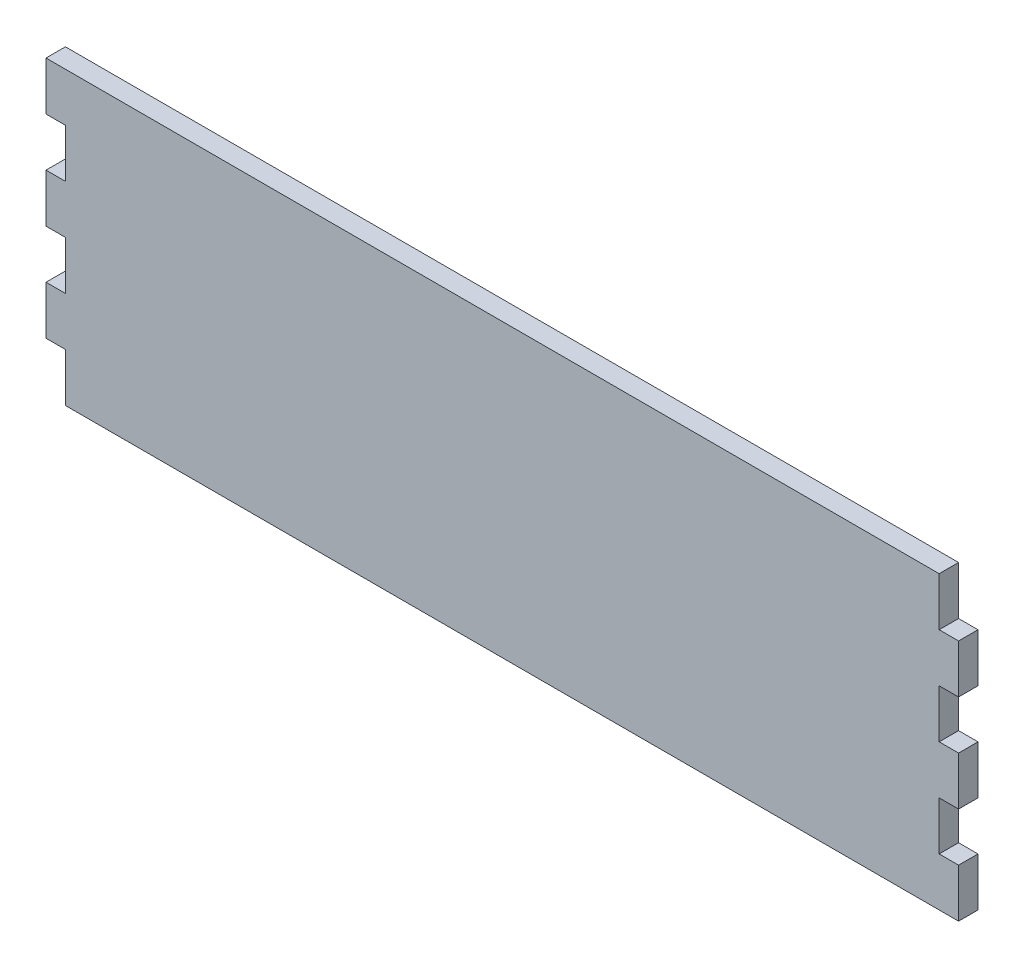
ISO-10303-21;
HEADER;
FILE_DESCRIPTION(('STEP AP214'),'2;1');
FILE_NAME('part.step','',(''),(''),'','','');
FILE_SCHEMA(('AUTOMOTIVE_DESIGN { 1 0 10303 214 1 1 1 1 }'));
ENDSEC;
DATA;
#1=APPLICATION_CONTEXT('core data for automotive mechanical design processes');
#2=APPLICATION_PROTOCOL_DEFINITION('international standard','automotive_design',2000,#1);
#3=PRODUCT_CONTEXT('',#1,'mechanical');
#4=PRODUCT('Part','Part','',(#3));
#5=PRODUCT_RELATED_PRODUCT_CATEGORY('part','',(#4));
#6=PRODUCT_DEFINITION_FORMATION('','',#4);
#7=PRODUCT_DEFINITION_CONTEXT('part definition',#1,'design');
#8=PRODUCT_DEFINITION('design','',#6,#7);
#9=PRODUCT_DEFINITION_SHAPE('','',#8);
#10=(LENGTH_UNIT() NAMED_UNIT(*) SI_UNIT(.MILLI.,.METRE.));
#11=(NAMED_UNIT(*) PLANE_ANGLE_UNIT() SI_UNIT($,.RADIAN.));
#12=(NAMED_UNIT(*) SI_UNIT($,.STERADIAN.) SOLID_ANGLE_UNIT());
#13=UNCERTAINTY_MEASURE_WITH_UNIT(LENGTH_MEASURE(1.E-05),#10,'distance_accuracy_value','');
#14=(GEOMETRIC_REPRESENTATION_CONTEXT(3) GLOBAL_UNCERTAINTY_ASSIGNED_CONTEXT((#13)) GLOBAL_UNIT_ASSIGNED_CONTEXT((#10,
#11,#12)) REPRESENTATION_CONTEXT('',''));
#15=CARTESIAN_POINT('',(0.,0.,0.));
#16=DIRECTION('',(0.,0.,1.));
#17=DIRECTION('',(1.,0.,0.));
#18=AXIS2_PLACEMENT_3D('',#15,#16,#17);
#19=CARTESIAN_POINT('',(230.,0.,5.));
#20=DIRECTION('',(0.,1.,0.));
#21=DIRECTION('',(-1.,0.,0.));
#22=AXIS2_PLACEMENT_3D('',#19,#20,#21);
#23=PLANE('',#22);
#24=DIRECTION('',(1.,0.,0.));
#25=VECTOR('',#24,1.);
#26=CARTESIAN_POINT('',(230.,0.,0.));
#27=LINE('',#26,#25);
#28=CARTESIAN_POINT('',(0.,0.,0.));
#29=VERTEX_POINT('',#28);
#30=CARTESIAN_POINT('',(230.,0.,0.));
#31=VERTEX_POINT('',#30);
#32=EDGE_CURVE('E227',#29,#31,#27,.T.);
#33=ORIENTED_EDGE('',*,*,#32,.T.);
#34=DIRECTION('',(0.,0.,-1.));
#35=VECTOR('',#34,1.);
#36=CARTESIAN_POINT('',(230.,0.,5.));
#37=LINE('',#36,#35);
#38=CARTESIAN_POINT('',(230.,0.,5.));
#39=VERTEX_POINT('',#38);
#40=EDGE_CURVE('E11',#39,#31,#37,.T.);
#41=ORIENTED_EDGE('',*,*,#40,.F.);
#42=DIRECTION('',(1.,0.,0.));
#43=VECTOR('',#42,1.);
#44=CARTESIAN_POINT('',(230.,0.,5.));
#45=LINE('',#44,#43);
#46=CARTESIAN_POINT('',(0.,0.,5.));
#47=VERTEX_POINT('',#46);
#48=EDGE_CURVE('E273',#47,#39,#45,.T.);
#49=ORIENTED_EDGE('',*,*,#48,.F.);
#50=DIRECTION('',(0.,0.,-1.));
#51=VECTOR('',#50,1.);
#52=CARTESIAN_POINT('',(0.,0.,5.));
#53=LINE('',#52,#51);
#54=EDGE_CURVE('E223',#47,#29,#53,.T.);
#55=ORIENTED_EDGE('',*,*,#54,.T.);
#56=EDGE_LOOP('',(#33,#41,#49,#55));
#57=FACE_BOUND('',#56,.T.);
#58=ADVANCED_FACE('F35',(#57),#23,.F.);
#59=CARTESIAN_POINT('',(230.,12.5,5.));
#60=DIRECTION('',(-1.,0.,0.));
#61=DIRECTION('',(0.,0.,1.));
#62=AXIS2_PLACEMENT_3D('',#59,#60,#61);
#63=PLANE('',#62);
#64=DIRECTION('',(0.,1.,0.));
#65=VECTOR('',#64,1.);
#66=CARTESIAN_POINT('',(230.,12.5,0.));
#67=LINE('',#66,#65);
#68=CARTESIAN_POINT('',(230.,12.5,0.));
#69=VERTEX_POINT('',#68);
#70=EDGE_CURVE('E230',#31,#69,#67,.T.);
#71=ORIENTED_EDGE('',*,*,#70,.T.);
#72=DIRECTION('',(0.,0.,-1.));
#73=VECTOR('',#72,1.);
#74=CARTESIAN_POINT('',(230.,12.5,5.));
#75=LINE('',#74,#73);
#76=CARTESIAN_POINT('',(230.,12.5,5.));
#77=VERTEX_POINT('',#76);
#78=EDGE_CURVE('E43',#77,#69,#75,.T.);
#79=ORIENTED_EDGE('',*,*,#78,.F.);
#80=DIRECTION('',(0.,1.,0.));
#81=VECTOR('',#80,1.);
#82=CARTESIAN_POINT('',(230.,12.5,5.));
#83=LINE('',#82,#81);
#84=EDGE_CURVE('E142',#39,#77,#83,.T.);
#85=ORIENTED_EDGE('',*,*,#84,.F.);
#86=ORIENTED_EDGE('',*,*,#40,.T.);
#87=EDGE_LOOP('',(#71,#79,#85,#86));
#88=FACE_BOUND('',#87,.T.);
#89=ADVANCED_FACE('F411',(#88),#63,.F.);
#90=CARTESIAN_POINT('',(225.,12.5,5.));
#91=DIRECTION('',(0.,-1.,0.));
#92=DIRECTION('',(0.,0.,-1.));
#93=AXIS2_PLACEMENT_3D('',#90,#91,#92);
#94=PLANE('',#93);
#95=DIRECTION('',(-1.,0.,0.));
#96=VECTOR('',#95,1.);
#97=CARTESIAN_POINT('',(225.,12.5,0.));
#98=LINE('',#97,#96);
#99=CARTESIAN_POINT('',(225.,12.5,0.));
#100=VERTEX_POINT('',#99);
#101=EDGE_CURVE('E232',#69,#100,#98,.T.);
#102=ORIENTED_EDGE('',*,*,#101,.T.);
#103=DIRECTION('',(0.,0.,-1.));
#104=VECTOR('',#103,1.);
#105=CARTESIAN_POINT('',(225.,12.5,5.));
#106=LINE('',#105,#104);
#107=CARTESIAN_POINT('',(225.,12.5,5.));
#108=VERTEX_POINT('',#107);
#109=EDGE_CURVE('E328',#108,#100,#106,.T.);
#110=ORIENTED_EDGE('',*,*,#109,.F.);
#111=DIRECTION('',(-1.,0.,0.));
#112=VECTOR('',#111,1.);
#113=CARTESIAN_POINT('',(225.,12.5,5.));
#114=LINE('',#113,#112);
#115=EDGE_CURVE('E336',#77,#108,#114,.T.);
#116=ORIENTED_EDGE('',*,*,#115,.F.);
#117=ORIENTED_EDGE('',*,*,#78,.T.);
#118=EDGE_LOOP('',(#102,#110,#116,#117));
#119=FACE_BOUND('',#118,.T.);
#120=ADVANCED_FACE('F334',(#119),#94,.F.);
#121=CARTESIAN_POINT('',(225.,25.,5.));
#122=DIRECTION('',(-1.,0.,0.));
#123=DIRECTION('',(0.,0.,1.));
#124=AXIS2_PLACEMENT_3D('',#121,#122,#123);
#125=PLANE('',#124);
#126=DIRECTION('',(0.,1.,0.));
#127=VECTOR('',#126,1.);
#128=CARTESIAN_POINT('',(225.,25.,0.));
#129=LINE('',#128,#127);
#130=CARTESIAN_POINT('',(225.,25.,0.));
#131=VERTEX_POINT('',#130);
#132=EDGE_CURVE('E234',#100,#131,#129,.T.);
#133=ORIENTED_EDGE('',*,*,#132,.T.);
#134=DIRECTION('',(0.,0.,-1.));
#135=VECTOR('',#134,1.);
#136=CARTESIAN_POINT('',(225.,25.,5.));
#137=LINE('',#136,#135);
#138=CARTESIAN_POINT('',(225.,25.,5.));
#139=VERTEX_POINT('',#138);
#140=EDGE_CURVE('E325',#139,#131,#137,.T.);
#141=ORIENTED_EDGE('',*,*,#140,.F.);
#142=DIRECTION('',(0.,1.,0.));
#143=VECTOR('',#142,1.);
#144=CARTESIAN_POINT('',(225.,25.,5.));
#145=LINE('',#144,#143);
#146=EDGE_CURVE('E354',#108,#139,#145,.T.);
#147=ORIENTED_EDGE('',*,*,#146,.F.);
#148=ORIENTED_EDGE('',*,*,#109,.T.);
#149=EDGE_LOOP('',(#133,#141,#147,#148));
#150=FACE_BOUND('',#149,.T.);
#151=ADVANCED_FACE('F345',(#150),#125,.F.);
#152=CARTESIAN_POINT('',(230.,25.,5.));
#153=DIRECTION('',(0.,1.,0.));
#154=DIRECTION('',(0.,0.,1.));
#155=AXIS2_PLACEMENT_3D('',#152,#153,#154);
#156=PLANE('',#155);
#157=DIRECTION('',(1.,0.,0.));
#158=VECTOR('',#157,1.);
#159=CARTESIAN_POINT('',(230.,25.,0.));
#160=LINE('',#159,#158);
#161=CARTESIAN_POINT('',(230.,25.,0.));
#162=VERTEX_POINT('',#161);
#163=EDGE_CURVE('E236',#131,#162,#160,.T.);
#164=ORIENTED_EDGE('',*,*,#163,.T.);
#165=DIRECTION('',(0.,0.,-1.));
#166=VECTOR('',#165,1.);
#167=CARTESIAN_POINT('',(230.,25.,5.));
#168=LINE('',#167,#166);
#169=CARTESIAN_POINT('',(230.,25.,5.));
#170=VERTEX_POINT('',#169);
#171=EDGE_CURVE('E322',#170,#162,#168,.T.);
#172=ORIENTED_EDGE('',*,*,#171,.F.);
#173=DIRECTION('',(1.,0.,0.));
#174=VECTOR('',#173,1.);
#175=CARTESIAN_POINT('',(230.,25.,5.));
#176=LINE('',#175,#174);
#177=EDGE_CURVE('E351',#139,#170,#176,.T.);
#178=ORIENTED_EDGE('',*,*,#177,.F.);
#179=ORIENTED_EDGE('',*,*,#140,.T.);
#180=EDGE_LOOP('',(#164,#172,#178,#179));
#181=FACE_BOUND('',#180,.T.);
#182=ADVANCED_FACE('F349',(#181),#156,.F.);
#183=CARTESIAN_POINT('',(230.,37.5,5.));
#184=DIRECTION('',(-1.,0.,0.));
#185=DIRECTION('',(0.,0.,1.));
#186=AXIS2_PLACEMENT_3D('',#183,#184,#185);
#187=PLANE('',#186);
#188=DIRECTION('',(0.,1.,0.));
#189=VECTOR('',#188,1.);
#190=CARTESIAN_POINT('',(230.,37.5,0.));
#191=LINE('',#190,#189);
#192=CARTESIAN_POINT('',(230.,37.5,0.));
#193=VERTEX_POINT('',#192);
#194=EDGE_CURVE('E238',#162,#193,#191,.T.);
#195=ORIENTED_EDGE('',*,*,#194,.T.);
#196=DIRECTION('',(0.,0.,-1.));
#197=VECTOR('',#196,1.);
#198=CARTESIAN_POINT('',(230.,37.5,5.));
#199=LINE('',#198,#197);
#200=CARTESIAN_POINT('',(230.,37.5,5.));
#201=VERTEX_POINT('',#200);
#202=EDGE_CURVE('E319',#201,#193,#199,.T.);
#203=ORIENTED_EDGE('',*,*,#202,.F.);
#204=DIRECTION('',(0.,1.,0.));
#205=VECTOR('',#204,1.);
#206=CARTESIAN_POINT('',(230.,37.5,5.));
#207=LINE('',#206,#205);
#208=EDGE_CURVE('E353',#170,#201,#207,.T.);
#209=ORIENTED_EDGE('',*,*,#208,.F.);
#210=ORIENTED_EDGE('',*,*,#171,.T.);
#211=EDGE_LOOP('',(#195,#203,#209,#210));
#212=FACE_BOUND('',#211,.T.);
#213=ADVANCED_FACE('F424',(#212),#187,.F.);
#214=CARTESIAN_POINT('',(225.,37.5,5.));
#215=DIRECTION('',(0.,-1.,0.));
#216=DIRECTION('',(0.,0.,-1.));
#217=AXIS2_PLACEMENT_3D('',#214,#215,#216);
#218=PLANE('',#217);
#219=DIRECTION('',(-1.,0.,0.));
#220=VECTOR('',#219,1.);
#221=CARTESIAN_POINT('',(225.,37.5,0.));
#222=LINE('',#221,#220);
#223=CARTESIAN_POINT('',(225.,37.5,0.));
#224=VERTEX_POINT('',#223);
#225=EDGE_CURVE('E240',#193,#224,#222,.T.);
#226=ORIENTED_EDGE('',*,*,#225,.T.);
#227=DIRECTION('',(0.,0.,-1.));
#228=VECTOR('',#227,1.);
#229=CARTESIAN_POINT('',(225.,37.5,5.));
#230=LINE('',#229,#228);
#231=CARTESIAN_POINT('',(225.,37.5,5.));
#232=VERTEX_POINT('',#231);
#233=EDGE_CURVE('E316',#232,#224,#230,.T.);
#234=ORIENTED_EDGE('',*,*,#233,.F.);
#235=DIRECTION('',(-1.,0.,0.));
#236=VECTOR('',#235,1.);
#237=CARTESIAN_POINT('',(225.,37.5,5.));
#238=LINE('',#237,#236);
#239=EDGE_CURVE('E356',#201,#232,#238,.T.);
#240=ORIENTED_EDGE('',*,*,#239,.F.);
#241=ORIENTED_EDGE('',*,*,#202,.T.);
#242=EDGE_LOOP('',(#226,#234,#240,#241));
#243=FACE_BOUND('',#242,.T.);
#244=ADVANCED_FACE('F427',(#243),#218,.F.);
#245=CARTESIAN_POINT('',(225.,50.,5.));
#246=DIRECTION('',(-1.,0.,0.));
#247=DIRECTION('',(0.,0.,1.));
#248=AXIS2_PLACEMENT_3D('',#245,#246,#247);
#249=PLANE('',#248);
#250=DIRECTION('',(0.,1.,0.));
#251=VECTOR('',#250,1.);
#252=CARTESIAN_POINT('',(225.,50.,0.));
#253=LINE('',#252,#251);
#254=CARTESIAN_POINT('',(225.,50.,0.));
#255=VERTEX_POINT('',#254);
#256=EDGE_CURVE('E242',#224,#255,#253,.T.);
#257=ORIENTED_EDGE('',*,*,#256,.T.);
#258=DIRECTION('',(0.,0.,-1.));
#259=VECTOR('',#258,1.);
#260=CARTESIAN_POINT('',(225.,50.,5.));
#261=LINE('',#260,#259);
#262=CARTESIAN_POINT('',(225.,50.,5.));
#263=VERTEX_POINT('',#262);
#264=EDGE_CURVE('E313',#263,#255,#261,.T.);
#265=ORIENTED_EDGE('',*,*,#264,.F.);
#266=DIRECTION('',(0.,1.,0.));
#267=VECTOR('',#266,1.);
#268=CARTESIAN_POINT('',(225.,50.,5.));
#269=LINE('',#268,#267);
#270=EDGE_CURVE('E362',#232,#263,#269,.T.);
#271=ORIENTED_EDGE('',*,*,#270,.F.);
#272=ORIENTED_EDGE('',*,*,#233,.T.);
#273=EDGE_LOOP('',(#257,#265,#271,#272));
#274=FACE_BOUND('',#273,.T.);
#275=ADVANCED_FACE('F431',(#274),#249,.F.);
#276=CARTESIAN_POINT('',(230.,50.,5.));
#277=DIRECTION('',(0.,1.,0.));
#278=DIRECTION('',(0.,0.,1.));
#279=AXIS2_PLACEMENT_3D('',#276,#277,#278);
#280=PLANE('',#279);
#281=DIRECTION('',(1.,0.,0.));
#282=VECTOR('',#281,1.);
#283=CARTESIAN_POINT('',(230.,50.,0.));
#284=LINE('',#283,#282);
#285=CARTESIAN_POINT('',(230.,50.,0.));
#286=VERTEX_POINT('',#285);
#287=EDGE_CURVE('E244',#255,#286,#284,.T.);
#288=ORIENTED_EDGE('',*,*,#287,.T.);
#289=DIRECTION('',(0.,0.,-1.));
#290=VECTOR('',#289,1.);
#291=CARTESIAN_POINT('',(230.,50.,5.));
#292=LINE('',#291,#290);
#293=CARTESIAN_POINT('',(230.,50.,5.));
#294=VERTEX_POINT('',#293);
#295=EDGE_CURVE('E310',#294,#286,#292,.T.);
#296=ORIENTED_EDGE('',*,*,#295,.F.);
#297=DIRECTION('',(1.,0.,0.));
#298=VECTOR('',#297,1.);
#299=CARTESIAN_POINT('',(230.,50.,5.));
#300=LINE('',#299,#298);
#301=EDGE_CURVE('E364',#263,#294,#300,.T.);
#302=ORIENTED_EDGE('',*,*,#301,.F.);
#303=ORIENTED_EDGE('',*,*,#264,.T.);
#304=EDGE_LOOP('',(#288,#296,#302,#303));
#305=FACE_BOUND('',#304,.T.);
#306=ADVANCED_FACE('F435',(#305),#280,.F.);
#307=CARTESIAN_POINT('',(230.,62.5,5.));
#308=DIRECTION('',(-1.,0.,0.));
#309=DIRECTION('',(0.,0.,1.));
#310=AXIS2_PLACEMENT_3D('',#307,#308,#309);
#311=PLANE('',#310);
#312=DIRECTION('',(0.,1.,0.));
#313=VECTOR('',#312,1.);
#314=CARTESIAN_POINT('',(230.,62.5,0.));
#315=LINE('',#314,#313);
#316=CARTESIAN_POINT('',(230.,62.5,0.));
#317=VERTEX_POINT('',#316);
#318=EDGE_CURVE('E246',#286,#317,#315,.T.);
#319=ORIENTED_EDGE('',*,*,#318,.T.);
#320=DIRECTION('',(0.,0.,-1.));
#321=VECTOR('',#320,1.);
#322=CARTESIAN_POINT('',(230.,62.5,5.));
#323=LINE('',#322,#321);
#324=CARTESIAN_POINT('',(230.,62.5,5.));
#325=VERTEX_POINT('',#324);
#326=EDGE_CURVE('E307',#325,#317,#323,.T.);
#327=ORIENTED_EDGE('',*,*,#326,.F.);
#328=DIRECTION('',(0.,1.,0.));
#329=VECTOR('',#328,1.);
#330=CARTESIAN_POINT('',(230.,62.5,5.));
#331=LINE('',#330,#329);
#332=EDGE_CURVE('E366',#294,#325,#331,.T.);
#333=ORIENTED_EDGE('',*,*,#332,.F.);
#334=ORIENTED_EDGE('',*,*,#295,.T.);
#335=EDGE_LOOP('',(#319,#327,#333,#334));
#336=FACE_BOUND('',#335,.T.);
#337=ADVANCED_FACE('F439',(#336),#311,.F.);
#338=CARTESIAN_POINT('',(225.,62.5,5.));
#339=DIRECTION('',(0.,-1.,0.));
#340=DIRECTION('',(0.,0.,-1.));
#341=AXIS2_PLACEMENT_3D('',#338,#339,#340);
#342=PLANE('',#341);
#343=DIRECTION('',(-1.,0.,0.));
#344=VECTOR('',#343,1.);
#345=CARTESIAN_POINT('',(225.,62.5,0.));
#346=LINE('',#345,#344);
#347=CARTESIAN_POINT('',(225.,62.5,0.));
#348=VERTEX_POINT('',#347);
#349=EDGE_CURVE('E248',#317,#348,#346,.T.);
#350=ORIENTED_EDGE('',*,*,#349,.T.);
#351=DIRECTION('',(0.,0.,-1.));
#352=VECTOR('',#351,1.);
#353=CARTESIAN_POINT('',(225.,62.5,5.));
#354=LINE('',#353,#352);
#355=CARTESIAN_POINT('',(225.,62.5,5.));
#356=VERTEX_POINT('',#355);
#357=EDGE_CURVE('E304',#356,#348,#354,.T.);
#358=ORIENTED_EDGE('',*,*,#357,.F.);
#359=DIRECTION('',(-1.,0.,0.));
#360=VECTOR('',#359,1.);
#361=CARTESIAN_POINT('',(225.,62.5,5.));
#362=LINE('',#361,#360);
#363=EDGE_CURVE('E368',#325,#356,#362,.T.);
#364=ORIENTED_EDGE('',*,*,#363,.F.);
#365=ORIENTED_EDGE('',*,*,#326,.T.);
#366=EDGE_LOOP('',(#350,#358,#364,#365));
#367=FACE_BOUND('',#366,.T.);
#368=ADVANCED_FACE('F443',(#367),#342,.F.);
#369=CARTESIAN_POINT('',(225.,62.5,5.));
#370=DIRECTION('',(-1.,0.,0.));
#371=DIRECTION('',(0.,0.,1.));
#372=AXIS2_PLACEMENT_3D('',#369,#370,#371);
#373=PLANE('',#372);
#374=DIRECTION('',(0.,1.,0.));
#375=VECTOR('',#374,1.);
#376=CARTESIAN_POINT('',(225.,62.5,0.));
#377=LINE('',#376,#375);
#378=CARTESIAN_POINT('',(225.,75.,0.));
#379=VERTEX_POINT('',#378);
#380=EDGE_CURVE('E250',#348,#379,#377,.T.);
#381=ORIENTED_EDGE('',*,*,#380,.T.);
#382=DIRECTION('',(0.,0.,-1.));
#383=VECTOR('',#382,1.);
#384=CARTESIAN_POINT('',(225.,75.,5.));
#385=LINE('',#384,#383);
#386=CARTESIAN_POINT('',(225.,75.,5.));
#387=VERTEX_POINT('',#386);
#388=EDGE_CURVE('E301',#387,#379,#385,.T.);
#389=ORIENTED_EDGE('',*,*,#388,.F.);
#390=DIRECTION('',(0.,1.,0.));
#391=VECTOR('',#390,1.);
#392=CARTESIAN_POINT('',(225.,62.5,5.));
#393=LINE('',#392,#391);
#394=EDGE_CURVE('E370',#356,#387,#393,.T.);
#395=ORIENTED_EDGE('',*,*,#394,.F.);
#396=ORIENTED_EDGE('',*,*,#357,.T.);
#397=EDGE_LOOP('',(#381,#389,#395,#396));
#398=FACE_BOUND('',#397,.T.);
#399=ADVANCED_FACE('F447',(#398),#373,.F.);
#400=CARTESIAN_POINT('',(-5.,75.,5.));
#401=DIRECTION('',(0.,-1.,0.));
#402=DIRECTION('',(0.,0.,-1.));
#403=AXIS2_PLACEMENT_3D('',#400,#401,#402);
#404=PLANE('',#403);
#405=DIRECTION('',(-1.,0.,0.));
#406=VECTOR('',#405,1.);
#407=CARTESIAN_POINT('',(-5.,75.,0.));
#408=LINE('',#407,#406);
#409=CARTESIAN_POINT('',(-5.,75.,0.));
#410=VERTEX_POINT('',#409);
#411=EDGE_CURVE('E252',#379,#410,#408,.T.);
#412=ORIENTED_EDGE('',*,*,#411,.T.);
#413=DIRECTION('',(0.,0.,-1.));
#414=VECTOR('',#413,1.);
#415=CARTESIAN_POINT('',(-5.,75.,5.));
#416=LINE('',#415,#414);
#417=CARTESIAN_POINT('',(-5.,75.,5.));
#418=VERTEX_POINT('',#417);
#419=EDGE_CURVE('E298',#418,#410,#416,.T.);
#420=ORIENTED_EDGE('',*,*,#419,.F.);
#421=DIRECTION('',(-1.,0.,0.));
#422=VECTOR('',#421,1.);
#423=CARTESIAN_POINT('',(-5.,75.,5.));
#424=LINE('',#423,#422);
#425=EDGE_CURVE('E372',#387,#418,#424,.T.);
#426=ORIENTED_EDGE('',*,*,#425,.F.);
#427=ORIENTED_EDGE('',*,*,#388,.T.);
#428=EDGE_LOOP('',(#412,#420,#426,#427));
#429=FACE_BOUND('',#428,.T.);
#430=ADVANCED_FACE('F451',(#429),#404,.F.);
#431=CARTESIAN_POINT('',(-5.,62.5,5.));
#432=DIRECTION('',(1.,0.,0.));
#433=DIRECTION('',(0.,0.,-1.));
#434=AXIS2_PLACEMENT_3D('',#431,#432,#433);
#435=PLANE('',#434);
#436=DIRECTION('',(0.,-1.,0.));
#437=VECTOR('',#436,1.);
#438=CARTESIAN_POINT('',(-5.,62.5,0.));
#439=LINE('',#438,#437);
#440=CARTESIAN_POINT('',(-5.,62.5,0.));
#441=VERTEX_POINT('',#440);
#442=EDGE_CURVE('E254',#410,#441,#439,.T.);
#443=ORIENTED_EDGE('',*,*,#442,.T.);
#444=DIRECTION('',(0.,0.,-1.));
#445=VECTOR('',#444,1.);
#446=CARTESIAN_POINT('',(-5.,62.5,5.));
#447=LINE('',#446,#445);
#448=CARTESIAN_POINT('',(-5.,62.5,5.));
#449=VERTEX_POINT('',#448);
#450=EDGE_CURVE('E295',#449,#441,#447,.T.);
#451=ORIENTED_EDGE('',*,*,#450,.F.);
#452=DIRECTION('',(0.,-1.,0.));
#453=VECTOR('',#452,1.);
#454=CARTESIAN_POINT('',(-5.,62.5,5.));
#455=LINE('',#454,#453);
#456=EDGE_CURVE('E374',#418,#449,#455,.T.);
#457=ORIENTED_EDGE('',*,*,#456,.F.);
#458=ORIENTED_EDGE('',*,*,#419,.T.);
#459=EDGE_LOOP('',(#443,#451,#457,#458));
#460=FACE_BOUND('',#459,.T.);
#461=ADVANCED_FACE('F455',(#460),#435,.F.);
#462=CARTESIAN_POINT('',(0.,62.5,5.));
#463=DIRECTION('',(0.,1.,0.));
#464=DIRECTION('',(0.,0.,1.));
#465=AXIS2_PLACEMENT_3D('',#462,#463,#464);
#466=PLANE('',#465);
#467=DIRECTION('',(1.,0.,0.));
#468=VECTOR('',#467,1.);
#469=CARTESIAN_POINT('',(0.,62.5,0.));
#470=LINE('',#469,#468);
#471=CARTESIAN_POINT('',(0.,62.5,0.));
#472=VERTEX_POINT('',#471);
#473=EDGE_CURVE('E256',#441,#472,#470,.T.);
#474=ORIENTED_EDGE('',*,*,#473,.T.);
#475=DIRECTION('',(0.,0.,-1.));
#476=VECTOR('',#475,1.);
#477=CARTESIAN_POINT('',(0.,62.5,5.));
#478=LINE('',#477,#476);
#479=CARTESIAN_POINT('',(0.,62.5,5.));
#480=VERTEX_POINT('',#479);
#481=EDGE_CURVE('E292',#480,#472,#478,.T.);
#482=ORIENTED_EDGE('',*,*,#481,.F.);
#483=DIRECTION('',(1.,0.,0.));
#484=VECTOR('',#483,1.);
#485=CARTESIAN_POINT('',(0.,62.5,5.));
#486=LINE('',#485,#484);
#487=EDGE_CURVE('E376',#449,#480,#486,.T.);
#488=ORIENTED_EDGE('',*,*,#487,.F.);
#489=ORIENTED_EDGE('',*,*,#450,.T.);
#490=EDGE_LOOP('',(#474,#482,#488,#489));
#491=FACE_BOUND('',#490,.T.);
#492=ADVANCED_FACE('F459',(#491),#466,.F.);
#493=CARTESIAN_POINT('',(0.,50.,5.));
#494=DIRECTION('',(1.,0.,0.));
#495=DIRECTION('',(0.,0.,-1.));
#496=AXIS2_PLACEMENT_3D('',#493,#494,#495);
#497=PLANE('',#496);
#498=DIRECTION('',(0.,-1.,0.));
#499=VECTOR('',#498,1.);
#500=CARTESIAN_POINT('',(0.,50.,0.));
#501=LINE('',#500,#499);
#502=CARTESIAN_POINT('',(0.,50.,0.));
#503=VERTEX_POINT('',#502);
#504=EDGE_CURVE('E258',#472,#503,#501,.T.);
#505=ORIENTED_EDGE('',*,*,#504,.T.);
#506=DIRECTION('',(0.,0.,-1.));
#507=VECTOR('',#506,1.);
#508=CARTESIAN_POINT('',(0.,50.,5.));
#509=LINE('',#508,#507);
#510=CARTESIAN_POINT('',(0.,50.,5.));
#511=VERTEX_POINT('',#510);
#512=EDGE_CURVE('E289',#511,#503,#509,.T.);
#513=ORIENTED_EDGE('',*,*,#512,.F.);
#514=DIRECTION('',(0.,-1.,0.));
#515=VECTOR('',#514,1.);
#516=CARTESIAN_POINT('',(0.,50.,5.));
#517=LINE('',#516,#515);
#518=EDGE_CURVE('E378',#480,#511,#517,.T.);
#519=ORIENTED_EDGE('',*,*,#518,.F.);
#520=ORIENTED_EDGE('',*,*,#481,.T.);
#521=EDGE_LOOP('',(#505,#513,#519,#520));
#522=FACE_BOUND('',#521,.T.);
#523=ADVANCED_FACE('F463',(#522),#497,.F.);
#524=CARTESIAN_POINT('',(-5.,50.,5.));
#525=DIRECTION('',(0.,-1.,0.));
#526=DIRECTION('',(0.,0.,-1.));
#527=AXIS2_PLACEMENT_3D('',#524,#525,#526);
#528=PLANE('',#527);
#529=DIRECTION('',(-1.,0.,0.));
#530=VECTOR('',#529,1.);
#531=CARTESIAN_POINT('',(-5.,50.,0.));
#532=LINE('',#531,#530);
#533=CARTESIAN_POINT('',(-5.,50.,0.));
#534=VERTEX_POINT('',#533);
#535=EDGE_CURVE('E260',#503,#534,#532,.T.);
#536=ORIENTED_EDGE('',*,*,#535,.T.);
#537=DIRECTION('',(0.,0.,-1.));
#538=VECTOR('',#537,1.);
#539=CARTESIAN_POINT('',(-5.,50.,5.));
#540=LINE('',#539,#538);
#541=CARTESIAN_POINT('',(-5.,50.,5.));
#542=VERTEX_POINT('',#541);
#543=EDGE_CURVE('E286',#542,#534,#540,.T.);
#544=ORIENTED_EDGE('',*,*,#543,.F.);
#545=DIRECTION('',(-1.,0.,0.));
#546=VECTOR('',#545,1.);
#547=CARTESIAN_POINT('',(-5.,50.,5.));
#548=LINE('',#547,#546);
#549=EDGE_CURVE('E380',#511,#542,#548,.T.);
#550=ORIENTED_EDGE('',*,*,#549,.F.);
#551=ORIENTED_EDGE('',*,*,#512,.T.);
#552=EDGE_LOOP('',(#536,#544,#550,#551));
#553=FACE_BOUND('',#552,.T.);
#554=ADVANCED_FACE('F467',(#553),#528,.F.);
#555=CARTESIAN_POINT('',(-5.,37.5,5.));
#556=DIRECTION('',(1.,0.,0.));
#557=DIRECTION('',(0.,0.,-1.));
#558=AXIS2_PLACEMENT_3D('',#555,#556,#557);
#559=PLANE('',#558);
#560=DIRECTION('',(0.,-1.,0.));
#561=VECTOR('',#560,1.);
#562=CARTESIAN_POINT('',(-5.,37.5,0.));
#563=LINE('',#562,#561);
#564=CARTESIAN_POINT('',(-5.,37.5,0.));
#565=VERTEX_POINT('',#564);
#566=EDGE_CURVE('E262',#534,#565,#563,.T.);
#567=ORIENTED_EDGE('',*,*,#566,.T.);
#568=DIRECTION('',(0.,0.,-1.));
#569=VECTOR('',#568,1.);
#570=CARTESIAN_POINT('',(-5.,37.5,5.));
#571=LINE('',#570,#569);
#572=CARTESIAN_POINT('',(-5.,37.5,5.));
#573=VERTEX_POINT('',#572);
#574=EDGE_CURVE('E283',#573,#565,#571,.T.);
#575=ORIENTED_EDGE('',*,*,#574,.F.);
#576=DIRECTION('',(0.,-1.,0.));
#577=VECTOR('',#576,1.);
#578=CARTESIAN_POINT('',(-5.,37.5,5.));
#579=LINE('',#578,#577);
#580=EDGE_CURVE('E382',#542,#573,#579,.T.);
#581=ORIENTED_EDGE('',*,*,#580,.F.);
#582=ORIENTED_EDGE('',*,*,#543,.T.);
#583=EDGE_LOOP('',(#567,#575,#581,#582));
#584=FACE_BOUND('',#583,.T.);
#585=ADVANCED_FACE('F471',(#584),#559,.F.);
#586=CARTESIAN_POINT('',(0.,37.5,5.));
#587=DIRECTION('',(0.,1.,0.));
#588=DIRECTION('',(0.,0.,1.));
#589=AXIS2_PLACEMENT_3D('',#586,#587,#588);
#590=PLANE('',#589);
#591=DIRECTION('',(1.,0.,0.));
#592=VECTOR('',#591,1.);
#593=CARTESIAN_POINT('',(0.,37.5,0.));
#594=LINE('',#593,#592);
#595=CARTESIAN_POINT('',(0.,37.5,0.));
#596=VERTEX_POINT('',#595);
#597=EDGE_CURVE('E264',#565,#596,#594,.T.);
#598=ORIENTED_EDGE('',*,*,#597,.T.);
#599=DIRECTION('',(0.,0.,-1.));
#600=VECTOR('',#599,1.);
#601=CARTESIAN_POINT('',(0.,37.5,5.));
#602=LINE('',#601,#600);
#603=CARTESIAN_POINT('',(0.,37.5,5.));
#604=VERTEX_POINT('',#603);
#605=EDGE_CURVE('E280',#604,#596,#602,.T.);
#606=ORIENTED_EDGE('',*,*,#605,.F.);
#607=DIRECTION('',(1.,0.,0.));
#608=VECTOR('',#607,1.);
#609=CARTESIAN_POINT('',(0.,37.5,5.));
#610=LINE('',#609,#608);
#611=EDGE_CURVE('E384',#573,#604,#610,.T.);
#612=ORIENTED_EDGE('',*,*,#611,.F.);
#613=ORIENTED_EDGE('',*,*,#574,.T.);
#614=EDGE_LOOP('',(#598,#606,#612,#613));
#615=FACE_BOUND('',#614,.T.);
#616=ADVANCED_FACE('F475',(#615),#590,.F.);
#617=CARTESIAN_POINT('',(0.,25.,5.));
#618=DIRECTION('',(1.,0.,0.));
#619=DIRECTION('',(0.,0.,-1.));
#620=AXIS2_PLACEMENT_3D('',#617,#618,#619);
#621=PLANE('',#620);
#622=DIRECTION('',(0.,-1.,0.));
#623=VECTOR('',#622,1.);
#624=CARTESIAN_POINT('',(0.,25.,0.));
#625=LINE('',#624,#623);
#626=CARTESIAN_POINT('',(0.,25.,0.));
#627=VERTEX_POINT('',#626);
#628=EDGE_CURVE('E266',#596,#627,#625,.T.);
#629=ORIENTED_EDGE('',*,*,#628,.T.);
#630=DIRECTION('',(0.,0.,-1.));
#631=VECTOR('',#630,1.);
#632=CARTESIAN_POINT('',(0.,25.,5.));
#633=LINE('',#632,#631);
#634=CARTESIAN_POINT('',(0.,25.,5.));
#635=VERTEX_POINT('',#634);
#636=EDGE_CURVE('E277',#635,#627,#633,.T.);
#637=ORIENTED_EDGE('',*,*,#636,.F.);
#638=DIRECTION('',(0.,-1.,0.));
#639=VECTOR('',#638,1.);
#640=CARTESIAN_POINT('',(0.,25.,5.));
#641=LINE('',#640,#639);
#642=EDGE_CURVE('E386',#604,#635,#641,.T.);
#643=ORIENTED_EDGE('',*,*,#642,.F.);
#644=ORIENTED_EDGE('',*,*,#605,.T.);
#645=EDGE_LOOP('',(#629,#637,#643,#644));
#646=FACE_BOUND('',#645,.T.);
#647=ADVANCED_FACE('F392',(#646),#621,.F.);
#648=CARTESIAN_POINT('',(-5.,25.,5.));
#649=DIRECTION('',(0.,-1.,0.));
#650=DIRECTION('',(0.,0.,-1.));
#651=AXIS2_PLACEMENT_3D('',#648,#649,#650);
#652=PLANE('',#651);
#653=DIRECTION('',(-1.,0.,0.));
#654=VECTOR('',#653,1.);
#655=CARTESIAN_POINT('',(-5.,25.,0.));
#656=LINE('',#655,#654);
#657=CARTESIAN_POINT('',(-5.,25.,0.));
#658=VERTEX_POINT('',#657);
#659=EDGE_CURVE('E268',#627,#658,#656,.T.);
#660=ORIENTED_EDGE('',*,*,#659,.T.);
#661=DIRECTION('',(0.,0.,-1.));
#662=VECTOR('',#661,1.);
#663=CARTESIAN_POINT('',(-5.,25.,5.));
#664=LINE('',#663,#662);
#665=CARTESIAN_POINT('',(-5.,25.,5.));
#666=VERTEX_POINT('',#665);
#667=EDGE_CURVE('E218',#666,#658,#664,.T.);
#668=ORIENTED_EDGE('',*,*,#667,.F.);
#669=DIRECTION('',(-1.,0.,0.));
#670=VECTOR('',#669,1.);
#671=CARTESIAN_POINT('',(-5.,25.,5.));
#672=LINE('',#671,#670);
#673=EDGE_CURVE('E209',#635,#666,#672,.T.);
#674=ORIENTED_EDGE('',*,*,#673,.F.);
#675=ORIENTED_EDGE('',*,*,#636,.T.);
#676=EDGE_LOOP('',(#660,#668,#674,#675));
#677=FACE_BOUND('',#676,.T.);
#678=ADVANCED_FACE('F396',(#677),#652,.F.);
#679=CARTESIAN_POINT('',(-5.,12.5,5.));
#680=DIRECTION('',(1.,0.,0.));
#681=DIRECTION('',(0.,0.,-1.));
#682=AXIS2_PLACEMENT_3D('',#679,#680,#681);
#683=PLANE('',#682);
#684=DIRECTION('',(0.,-1.,0.));
#685=VECTOR('',#684,1.);
#686=CARTESIAN_POINT('',(-5.,12.5,0.));
#687=LINE('',#686,#685);
#688=CARTESIAN_POINT('',(-5.,12.5,0.));
#689=VERTEX_POINT('',#688);
#690=EDGE_CURVE('E217',#658,#689,#687,.T.);
#691=ORIENTED_EDGE('',*,*,#690,.T.);
#692=DIRECTION('',(0.,0.,-1.));
#693=VECTOR('',#692,1.);
#694=CARTESIAN_POINT('',(-5.,12.5,5.));
#695=LINE('',#694,#693);
#696=CARTESIAN_POINT('',(-5.,12.5,5.));
#697=VERTEX_POINT('',#696);
#698=EDGE_CURVE('E214',#697,#689,#695,.T.);
#699=ORIENTED_EDGE('',*,*,#698,.F.);
#700=DIRECTION('',(0.,-1.,0.));
#701=VECTOR('',#700,1.);
#702=CARTESIAN_POINT('',(-5.,12.5,5.));
#703=LINE('',#702,#701);
#704=EDGE_CURVE('E203',#666,#697,#703,.T.);
#705=ORIENTED_EDGE('',*,*,#704,.F.);
#706=ORIENTED_EDGE('',*,*,#667,.T.);
#707=EDGE_LOOP('',(#691,#699,#705,#706));
#708=FACE_BOUND('',#707,.T.);
#709=ADVANCED_FACE('F215',(#708),#683,.F.);
#710=CARTESIAN_POINT('',(0.,12.5,5.));
#711=DIRECTION('',(0.,1.,0.));
#712=DIRECTION('',(0.,0.,1.));
#713=AXIS2_PLACEMENT_3D('',#710,#711,#712);
#714=PLANE('',#713);
#715=DIRECTION('',(1.,0.,0.));
#716=VECTOR('',#715,1.);
#717=CARTESIAN_POINT('',(0.,12.5,0.));
#718=LINE('',#717,#716);
#719=CARTESIAN_POINT('',(0.,12.5,0.));
#720=VERTEX_POINT('',#719);
#721=EDGE_CURVE('E128',#689,#720,#718,.T.);
#722=ORIENTED_EDGE('',*,*,#721,.T.);
#723=DIRECTION('',(0.,0.,-1.));
#724=VECTOR('',#723,1.);
#725=CARTESIAN_POINT('',(0.,12.5,5.));
#726=LINE('',#725,#724);
#727=CARTESIAN_POINT('',(0.,12.5,5.));
#728=VERTEX_POINT('',#727);
#729=EDGE_CURVE('E219',#728,#720,#726,.T.);
#730=ORIENTED_EDGE('',*,*,#729,.F.);
#731=DIRECTION('',(1.,0.,0.));
#732=VECTOR('',#731,1.);
#733=CARTESIAN_POINT('',(0.,12.5,5.));
#734=LINE('',#733,#732);
#735=EDGE_CURVE('E207',#697,#728,#734,.T.);
#736=ORIENTED_EDGE('',*,*,#735,.F.);
#737=ORIENTED_EDGE('',*,*,#698,.T.);
#738=EDGE_LOOP('',(#722,#730,#736,#737));
#739=FACE_BOUND('',#738,.T.);
#740=ADVANCED_FACE('F221',(#739),#714,.F.);
#741=CARTESIAN_POINT('',(0.,0.,5.));
#742=DIRECTION('',(1.,0.,0.));
#743=DIRECTION('',(0.,0.,-1.));
#744=AXIS2_PLACEMENT_3D('',#741,#742,#743);
#745=PLANE('',#744);
#746=DIRECTION('',(0.,-1.,0.));
#747=VECTOR('',#746,1.);
#748=CARTESIAN_POINT('',(0.,0.,0.));
#749=LINE('',#748,#747);
#750=EDGE_CURVE('E134',#720,#29,#749,.T.);
#751=ORIENTED_EDGE('',*,*,#750,.T.);
#752=ORIENTED_EDGE('',*,*,#54,.F.);
#753=DIRECTION('',(0.,-1.,0.));
#754=VECTOR('',#753,1.);
#755=CARTESIAN_POINT('',(0.,0.,5.));
#756=LINE('',#755,#754);
#757=EDGE_CURVE('E51',#728,#47,#756,.T.);
#758=ORIENTED_EDGE('',*,*,#757,.F.);
#759=ORIENTED_EDGE('',*,*,#729,.T.);
#760=EDGE_LOOP('',(#751,#752,#758,#759));
#761=FACE_BOUND('',#760,.T.);
#762=ADVANCED_FACE('F400',(#761),#745,.F.);
#763=CARTESIAN_POINT('',(0.,0.,5.));
#764=DIRECTION('',(0.,0.,-1.));
#765=DIRECTION('',(-1.,0.,0.));
#766=AXIS2_PLACEMENT_3D('',#763,#764,#765);
#767=PLANE('',#766);
#768=ORIENTED_EDGE('',*,*,#48,.T.);
#769=ORIENTED_EDGE('',*,*,#84,.T.);
#770=ORIENTED_EDGE('',*,*,#115,.T.);
#771=ORIENTED_EDGE('',*,*,#146,.T.);
#772=ORIENTED_EDGE('',*,*,#177,.T.);
#773=ORIENTED_EDGE('',*,*,#208,.T.);
#774=ORIENTED_EDGE('',*,*,#239,.T.);
#775=ORIENTED_EDGE('',*,*,#270,.T.);
#776=ORIENTED_EDGE('',*,*,#301,.T.);
#777=ORIENTED_EDGE('',*,*,#332,.T.);
#778=ORIENTED_EDGE('',*,*,#363,.T.);
#779=ORIENTED_EDGE('',*,*,#394,.T.);
#780=ORIENTED_EDGE('',*,*,#425,.T.);
#781=ORIENTED_EDGE('',*,*,#456,.T.);
#782=ORIENTED_EDGE('',*,*,#487,.T.);
#783=ORIENTED_EDGE('',*,*,#518,.T.);
#784=ORIENTED_EDGE('',*,*,#549,.T.);
#785=ORIENTED_EDGE('',*,*,#580,.T.);
#786=ORIENTED_EDGE('',*,*,#611,.T.);
#787=ORIENTED_EDGE('',*,*,#642,.T.);
#788=ORIENTED_EDGE('',*,*,#673,.T.);
#789=ORIENTED_EDGE('',*,*,#704,.T.);
#790=ORIENTED_EDGE('',*,*,#735,.T.);
#791=ORIENTED_EDGE('',*,*,#757,.T.);
#792=EDGE_LOOP('',(#768,#769,#770,#771,#772,#773,#774,#775,#776,#777,#778,#779,#780,#781,#782,
#783,#784,#785,#786,#787,#788,#789,#790,#791));
#793=FACE_BOUND('',#792,.T.);
#794=ADVANCED_FACE('F205',(#793),#767,.F.);
#795=CARTESIAN_POINT('',(0.,0.,0.));
#796=DIRECTION('',(0.,0.,-1.));
#797=DIRECTION('',(-1.,0.,0.));
#798=AXIS2_PLACEMENT_3D('',#795,#796,#797);
#799=PLANE('',#798);
#800=ORIENTED_EDGE('',*,*,#32,.F.);
#801=ORIENTED_EDGE('',*,*,#750,.F.);
#802=ORIENTED_EDGE('',*,*,#721,.F.);
#803=ORIENTED_EDGE('',*,*,#690,.F.);
#804=ORIENTED_EDGE('',*,*,#659,.F.);
#805=ORIENTED_EDGE('',*,*,#628,.F.);
#806=ORIENTED_EDGE('',*,*,#597,.F.);
#807=ORIENTED_EDGE('',*,*,#566,.F.);
#808=ORIENTED_EDGE('',*,*,#535,.F.);
#809=ORIENTED_EDGE('',*,*,#504,.F.);
#810=ORIENTED_EDGE('',*,*,#473,.F.);
#811=ORIENTED_EDGE('',*,*,#442,.F.);
#812=ORIENTED_EDGE('',*,*,#411,.F.);
#813=ORIENTED_EDGE('',*,*,#380,.F.);
#814=ORIENTED_EDGE('',*,*,#349,.F.);
#815=ORIENTED_EDGE('',*,*,#318,.F.);
#816=ORIENTED_EDGE('',*,*,#287,.F.);
#817=ORIENTED_EDGE('',*,*,#256,.F.);
#818=ORIENTED_EDGE('',*,*,#225,.F.);
#819=ORIENTED_EDGE('',*,*,#194,.F.);
#820=ORIENTED_EDGE('',*,*,#163,.F.);
#821=ORIENTED_EDGE('',*,*,#132,.F.);
#822=ORIENTED_EDGE('',*,*,#101,.F.);
#823=ORIENTED_EDGE('',*,*,#70,.F.);
#824=EDGE_LOOP('',(#800,#801,#802,#803,#804,#805,#806,#807,#808,#809,#810,#811,#812,#813,#814,
#815,#816,#817,#818,#819,#820,#821,#822,#823));
#825=FACE_BOUND('',#824,.T.);
#826=ADVANCED_FACE('F340',(#825),#799,.T.);
#827=CLOSED_SHELL('',(#58,#89,#120,#151,#182,#213,#244,#275,#306,#337,#368,#399,#430,#461,#492,
#523,#554,#585,#616,#647,#678,#709,#740,#762,#794,#826));
#828=MANIFOLD_SOLID_BREP('B2',#827);
#829=ADVANCED_BREP_SHAPE_REPRESENTATION('',(#18,#828),#14);
#830=SHAPE_DEFINITION_REPRESENTATION(#9,#829);
ENDSEC;
END-ISO-10303-21;
